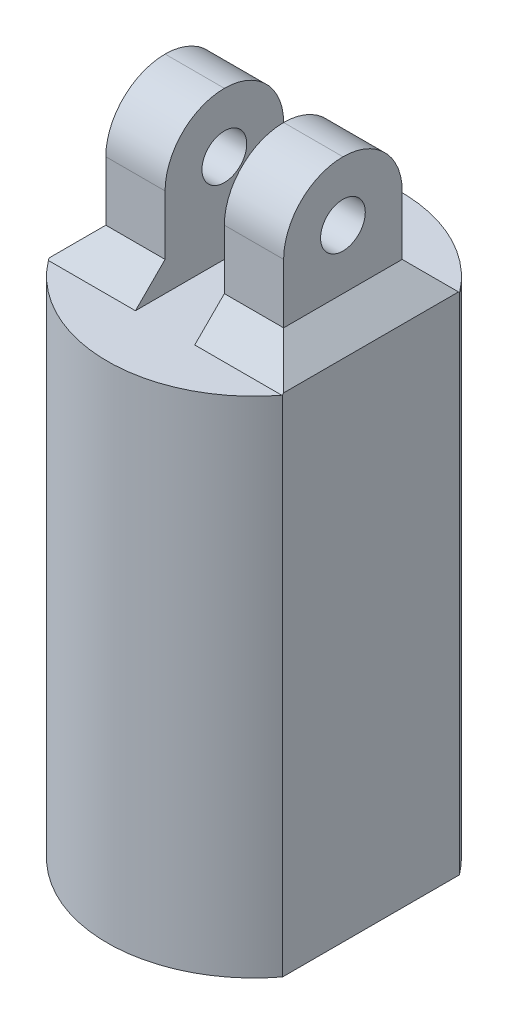
ISO-10303-21;
HEADER;
FILE_DESCRIPTION(('STEP AP214'),'2;1');
FILE_NAME('part.step','',(''),(''),'','','');
FILE_SCHEMA(('AUTOMOTIVE_DESIGN { 1 0 10303 214 1 1 1 1 }'));
ENDSEC;
DATA;
#1=APPLICATION_CONTEXT('core data for automotive mechanical design processes');
#2=APPLICATION_PROTOCOL_DEFINITION('international standard','automotive_design',2000,#1);
#3=PRODUCT_CONTEXT('',#1,'mechanical');
#4=PRODUCT('Part','Part','',(#3));
#5=PRODUCT_RELATED_PRODUCT_CATEGORY('part','',(#4));
#6=PRODUCT_DEFINITION_FORMATION('','',#4);
#7=PRODUCT_DEFINITION_CONTEXT('part definition',#1,'design');
#8=PRODUCT_DEFINITION('design','',#6,#7);
#9=PRODUCT_DEFINITION_SHAPE('','',#8);
#10=(LENGTH_UNIT() NAMED_UNIT(*) SI_UNIT(.MILLI.,.METRE.));
#11=(NAMED_UNIT(*) PLANE_ANGLE_UNIT() SI_UNIT($,.RADIAN.));
#12=(NAMED_UNIT(*) SI_UNIT($,.STERADIAN.) SOLID_ANGLE_UNIT());
#13=UNCERTAINTY_MEASURE_WITH_UNIT(LENGTH_MEASURE(1.E-05),#10,'distance_accuracy_value','');
#14=(GEOMETRIC_REPRESENTATION_CONTEXT(3) GLOBAL_UNCERTAINTY_ASSIGNED_CONTEXT((#13)) GLOBAL_UNIT_ASSIGNED_CONTEXT((#10,
#11,#12)) REPRESENTATION_CONTEXT('',''));
#15=CARTESIAN_POINT('',(0.,0.,0.));
#16=DIRECTION('',(0.,0.,1.));
#17=DIRECTION('',(1.,0.,0.));
#18=AXIS2_PLACEMENT_3D('',#15,#16,#17);
#19=CARTESIAN_POINT('',(0.,34.,0.));
#20=DIRECTION('',(0.,1.,0.));
#21=DIRECTION('',(0.,0.,1.));
#22=AXIS2_PLACEMENT_3D('',#19,#20,#21);
#23=PLANE('',#22);
#24=CARTESIAN_POINT('',(0.,34.,0.));
#25=DIRECTION('',(0.,1.,0.));
#26=DIRECTION('',(0.,0.,1.));
#27=AXIS2_PLACEMENT_3D('',#24,#25,#26);
#28=CIRCLE('',#27,9.9);
#29=CARTESIAN_POINT('',(7.874642849044,34.,-6.00000000000001));
#30=VERTEX_POINT('',#29);
#31=CARTESIAN_POINT('',(-7.87464284904402,34.,-5.99999999999999));
#32=VERTEX_POINT('',#31);
#33=EDGE_CURVE('E270',#30,#32,#28,.T.);
#34=ORIENTED_EDGE('',*,*,#33,.T.);
#35=DIRECTION('',(1.,0.,0.));
#36=VECTOR('',#35,1.);
#37=CARTESIAN_POINT('',(0.,34.,-5.99999999999999));
#38=LINE('',#37,#36);
#39=CARTESIAN_POINT('',(-2.,34.,-5.99999999999999));
#40=VERTEX_POINT('',#39);
#41=EDGE_CURVE('E343',#32,#40,#38,.T.);
#42=ORIENTED_EDGE('',*,*,#41,.T.);
#43=DIRECTION('',(0.,0.,-1.));
#44=VECTOR('',#43,1.);
#45=CARTESIAN_POINT('',(-2.,34.,4.));
#46=LINE('',#45,#44);
#47=CARTESIAN_POINT('',(-2.,34.,5.99999999999999));
#48=VERTEX_POINT('',#47);
#49=EDGE_CURVE('E472',#48,#40,#46,.T.);
#50=ORIENTED_EDGE('',*,*,#49,.F.);
#51=DIRECTION('',(-1.,0.,0.));
#52=VECTOR('',#51,1.);
#53=CARTESIAN_POINT('',(0.,34.,5.99999999999999));
#54=LINE('',#53,#52);
#55=CARTESIAN_POINT('',(-7.87464284904402,34.,5.99999999999999));
#56=VERTEX_POINT('',#55);
#57=EDGE_CURVE('E340',#48,#56,#54,.T.);
#58=ORIENTED_EDGE('',*,*,#57,.T.);
#59=CARTESIAN_POINT('',(0.,34.,0.));
#60=DIRECTION('',(0.,1.,0.));
#61=DIRECTION('',(0.,0.,1.));
#62=AXIS2_PLACEMENT_3D('',#59,#60,#61);
#63=CIRCLE('',#62,9.9);
#64=CARTESIAN_POINT('',(7.874642849044,34.,6.00000000000001));
#65=VERTEX_POINT('',#64);
#66=EDGE_CURVE('E262',#56,#65,#63,.T.);
#67=ORIENTED_EDGE('',*,*,#66,.T.);
#68=DIRECTION('',(-1.,0.,0.));
#69=VECTOR('',#68,1.);
#70=CARTESIAN_POINT('',(0.,34.,6.00000000000001));
#71=LINE('',#70,#69);
#72=CARTESIAN_POINT('',(2.,34.,6.00000000000001));
#73=VERTEX_POINT('',#72);
#74=EDGE_CURVE('E333',#65,#73,#71,.T.);
#75=ORIENTED_EDGE('',*,*,#74,.T.);
#76=DIRECTION('',(0.,0.,1.));
#77=VECTOR('',#76,1.);
#78=CARTESIAN_POINT('',(2.,34.,4.));
#79=LINE('',#78,#77);
#80=CARTESIAN_POINT('',(2.,34.,-6.00000000000001));
#81=VERTEX_POINT('',#80);
#82=EDGE_CURVE('E454',#81,#73,#79,.T.);
#83=ORIENTED_EDGE('',*,*,#82,.F.);
#84=DIRECTION('',(1.,0.,0.));
#85=VECTOR('',#84,1.);
#86=CARTESIAN_POINT('',(0.,34.,-6.00000000000001));
#87=LINE('',#86,#85);
#88=EDGE_CURVE('E337',#81,#30,#87,.T.);
#89=ORIENTED_EDGE('',*,*,#88,.T.);
#90=EDGE_LOOP('',(#34,#42,#50,#58,#67,#75,#83,#89));
#91=FACE_BOUND('',#90,.T.);
#92=ADVANCED_FACE('F49',(#91),#23,.T.);
#93=CARTESIAN_POINT('',(0.,34.,0.));
#94=DIRECTION('',(0.,-1.,0.));
#95=DIRECTION('',(0.,0.,-1.));
#96=AXIS2_PLACEMENT_3D('',#93,#94,#95);
#97=CYLINDRICAL_SURFACE('',#96,9.9);
#98=CARTESIAN_POINT('',(0.,0.,0.));
#99=DIRECTION('',(0.,1.,0.));
#100=DIRECTION('',(0.,0.,1.));
#101=AXIS2_PLACEMENT_3D('',#98,#99,#100);
#102=CIRCLE('',#101,9.9);
#103=CARTESIAN_POINT('',(7.9,0.,-5.96657355607052));
#104=VERTEX_POINT('',#103);
#105=CARTESIAN_POINT('',(-7.9,0.,-5.96657355607052));
#106=VERTEX_POINT('',#105);
#107=EDGE_CURVE('E234',#104,#106,#102,.T.);
#108=ORIENTED_EDGE('',*,*,#107,.T.);
#109=DIRECTION('',(0.,-1.,0.));
#110=VECTOR('',#109,1.);
#111=CARTESIAN_POINT('',(-7.9,34.,-5.96657355607052));
#112=LINE('',#111,#110);
#113=CARTESIAN_POINT('',(-7.9,34.0334264439295,-5.96657355607052));
#114=VERTEX_POINT('',#113);
#115=EDGE_CURVE('E241',#114,#106,#112,.T.);
#116=ORIENTED_EDGE('',*,*,#115,.F.);
#117=CARTESIAN_POINT('',(0.,40.0000000000001,0.));
#118=DIRECTION('',(0.,-0.707106781186544,0.707106781186551));
#119=DIRECTION('',(0.,-0.707106781186551,-0.707106781186544));
#120=AXIS2_PLACEMENT_3D('',#117,#118,#119);
#121=ELLIPSE('',#120,14.0007142674937,9.9);
#122=EDGE_CURVE('E365',#114,#32,#121,.T.);
#123=ORIENTED_EDGE('',*,*,#122,.T.);
#124=ORIENTED_EDGE('',*,*,#33,.F.);
#125=CARTESIAN_POINT('',(0.,40.0000000000001,0.));
#126=DIRECTION('',(0.,-0.707106781186544,0.707106781186552));
#127=DIRECTION('',(0.,-0.707106781186552,-0.707106781186544));
#128=AXIS2_PLACEMENT_3D('',#125,#126,#127);
#129=ELLIPSE('',#128,14.0007142674937,9.9);
#130=CARTESIAN_POINT('',(7.9,34.0334264439295,-5.96657355607052));
#131=VERTEX_POINT('',#130);
#132=EDGE_CURVE('E389',#30,#131,#129,.T.);
#133=ORIENTED_EDGE('',*,*,#132,.T.);
#134=DIRECTION('',(0.,-1.,0.));
#135=VECTOR('',#134,1.);
#136=CARTESIAN_POINT('',(7.9,34.,-5.96657355607052));
#137=LINE('',#136,#135);
#138=EDGE_CURVE('E82',#131,#104,#137,.T.);
#139=ORIENTED_EDGE('',*,*,#138,.T.);
#140=EDGE_LOOP('',(#108,#116,#123,#124,#133,#139));
#141=FACE_BOUND('',#140,.T.);
#142=ADVANCED_FACE('F251',(#141),#97,.T.);
#143=CARTESIAN_POINT('',(-7.9,34.,-5.96657355607052));
#144=DIRECTION('',(1.,0.,0.));
#145=DIRECTION('',(0.,0.,-1.));
#146=AXIS2_PLACEMENT_3D('',#143,#144,#145);
#147=PLANE('',#146);
#148=DIRECTION('',(0.,-1.,0.));
#149=VECTOR('',#148,1.);
#150=CARTESIAN_POINT('',(-7.9,34.,5.96657355607052));
#151=LINE('',#150,#149);
#152=CARTESIAN_POINT('',(-7.9,34.0334264439295,5.96657355607052));
#153=VERTEX_POINT('',#152);
#154=CARTESIAN_POINT('',(-7.9,0.,5.96657355607052));
#155=VERTEX_POINT('',#154);
#156=EDGE_CURVE('E249',#153,#155,#151,.T.);
#157=ORIENTED_EDGE('',*,*,#156,.F.);
#158=DIRECTION('',(0.,0.707106781186551,-0.707106781186544));
#159=VECTOR('',#158,1.);
#160=CARTESIAN_POINT('',(-7.9,39.9832867780353,0.0167132219648022));
#161=LINE('',#160,#159);
#162=CARTESIAN_POINT('',(-7.9,34.1,5.9));
#163=VERTEX_POINT('',#162);
#164=EDGE_CURVE('E382',#153,#163,#161,.T.);
#165=ORIENTED_EDGE('',*,*,#164,.T.);
#166=DIRECTION('',(0.,0.,-1.));
#167=VECTOR('',#166,1.);
#168=CARTESIAN_POINT('',(-7.9,34.1,-5.96657355607052));
#169=LINE('',#168,#167);
#170=CARTESIAN_POINT('',(-7.9,34.1,-5.9));
#171=VERTEX_POINT('',#170);
#172=EDGE_CURVE('E371',#163,#171,#169,.T.);
#173=ORIENTED_EDGE('',*,*,#172,.T.);
#174=DIRECTION('',(0.,-0.707106781186551,-0.707106781186544));
#175=VECTOR('',#174,1.);
#176=CARTESIAN_POINT('',(-7.9,34.0167132219647,-5.98328677803526));
#177=LINE('',#176,#175);
#178=EDGE_CURVE('E244',#171,#114,#177,.T.);
#179=ORIENTED_EDGE('',*,*,#178,.T.);
#180=ORIENTED_EDGE('',*,*,#115,.T.);
#181=DIRECTION('',(0.,0.,1.));
#182=VECTOR('',#181,1.);
#183=CARTESIAN_POINT('',(-7.9,0.,-5.96657355607052));
#184=LINE('',#183,#182);
#185=EDGE_CURVE('E229',#106,#155,#184,.T.);
#186=ORIENTED_EDGE('',*,*,#185,.T.);
#187=EDGE_LOOP('',(#157,#165,#173,#179,#180,#186));
#188=FACE_BOUND('',#187,.T.);
#189=ADVANCED_FACE('F242',(#188),#147,.F.);
#190=CARTESIAN_POINT('',(0.,34.,0.));
#191=DIRECTION('',(0.,-1.,0.));
#192=DIRECTION('',(0.,0.,-1.));
#193=AXIS2_PLACEMENT_3D('',#190,#191,#192);
#194=CYLINDRICAL_SURFACE('',#193,9.9);
#195=CARTESIAN_POINT('',(0.,0.,0.));
#196=DIRECTION('',(0.,1.,0.));
#197=DIRECTION('',(0.,0.,1.));
#198=AXIS2_PLACEMENT_3D('',#195,#196,#197);
#199=CIRCLE('',#198,9.9);
#200=CARTESIAN_POINT('',(7.9,0.,5.96657355607052));
#201=VERTEX_POINT('',#200);
#202=EDGE_CURVE('E235',#155,#201,#199,.T.);
#203=ORIENTED_EDGE('',*,*,#202,.T.);
#204=DIRECTION('',(0.,-1.,0.));
#205=VECTOR('',#204,1.);
#206=CARTESIAN_POINT('',(7.9,34.,5.96657355607052));
#207=LINE('',#206,#205);
#208=CARTESIAN_POINT('',(7.9,34.0334264439295,5.96657355607052));
#209=VERTEX_POINT('',#208);
#210=EDGE_CURVE('E71',#209,#201,#207,.T.);
#211=ORIENTED_EDGE('',*,*,#210,.F.);
#212=CARTESIAN_POINT('',(0.,40.0000000000001,0.));
#213=DIRECTION('',(0.,-0.707106781186544,-0.707106781186552));
#214=DIRECTION('',(0.,-0.707106781186552,0.707106781186544));
#215=AXIS2_PLACEMENT_3D('',#212,#213,#214);
#216=ELLIPSE('',#215,14.0007142674937,9.9);
#217=EDGE_CURVE('E398',#209,#65,#216,.T.);
#218=ORIENTED_EDGE('',*,*,#217,.T.);
#219=ORIENTED_EDGE('',*,*,#66,.F.);
#220=CARTESIAN_POINT('',(0.,40.0000000000001,0.));
#221=DIRECTION('',(0.,-0.707106781186544,-0.707106781186551));
#222=DIRECTION('',(0.,-0.707106781186551,0.707106781186544));
#223=AXIS2_PLACEMENT_3D('',#220,#221,#222);
#224=ELLIPSE('',#223,14.0007142674937,9.9);
#225=EDGE_CURVE('E378',#56,#153,#224,.T.);
#226=ORIENTED_EDGE('',*,*,#225,.T.);
#227=ORIENTED_EDGE('',*,*,#156,.T.);
#228=EDGE_LOOP('',(#203,#211,#218,#219,#226,#227));
#229=FACE_BOUND('',#228,.T.);
#230=ADVANCED_FACE('F510',(#229),#194,.T.);
#231=CARTESIAN_POINT('',(7.9,34.,-5.96657355607052));
#232=DIRECTION('',(-1.,0.,0.));
#233=DIRECTION('',(0.,0.,1.));
#234=AXIS2_PLACEMENT_3D('',#231,#232,#233);
#235=PLANE('',#234);
#236=DIRECTION('',(0.,0.,-1.));
#237=VECTOR('',#236,1.);
#238=CARTESIAN_POINT('',(7.9,0.,-5.96657355607052));
#239=LINE('',#238,#237);
#240=EDGE_CURVE('E267',#201,#104,#239,.T.);
#241=ORIENTED_EDGE('',*,*,#240,.T.);
#242=ORIENTED_EDGE('',*,*,#138,.F.);
#243=DIRECTION('',(0.,0.707106781186552,0.707106781186544));
#244=VECTOR('',#243,1.);
#245=CARTESIAN_POINT('',(7.9,34.0167132219647,-5.98328677803527));
#246=LINE('',#245,#244);
#247=CARTESIAN_POINT('',(7.9,34.1,-5.9));
#248=VERTEX_POINT('',#247);
#249=EDGE_CURVE('E392',#131,#248,#246,.T.);
#250=ORIENTED_EDGE('',*,*,#249,.T.);
#251=DIRECTION('',(0.,0.,1.));
#252=VECTOR('',#251,1.);
#253=CARTESIAN_POINT('',(7.9,34.1,-5.96657355607052));
#254=LINE('',#253,#252);
#255=CARTESIAN_POINT('',(7.9,34.1,5.9));
#256=VERTEX_POINT('',#255);
#257=EDGE_CURVE('E11',#248,#256,#254,.T.);
#258=ORIENTED_EDGE('',*,*,#257,.T.);
#259=DIRECTION('',(0.,-0.707106781186552,0.707106781186544));
#260=VECTOR('',#259,1.);
#261=CARTESIAN_POINT('',(7.9,39.9832867780353,0.0167132219648161));
#262=LINE('',#261,#260);
#263=EDGE_CURVE('E395',#256,#209,#262,.T.);
#264=ORIENTED_EDGE('',*,*,#263,.T.);
#265=ORIENTED_EDGE('',*,*,#210,.T.);
#266=EDGE_LOOP('',(#241,#242,#250,#258,#264,#265));
#267=FACE_BOUND('',#266,.T.);
#268=ADVANCED_FACE('F431',(#267),#235,.F.);
#269=CARTESIAN_POINT('',(0.,0.,0.));
#270=DIRECTION('',(0.,1.,0.));
#271=DIRECTION('',(0.,0.,1.));
#272=AXIS2_PLACEMENT_3D('',#269,#270,#271);
#273=PLANE('',#272);
#274=CARTESIAN_POINT('',(0.,0.,0.));
#275=DIRECTION('',(0.,-1.,0.));
#276=DIRECTION('',(0.,0.,-1.));
#277=AXIS2_PLACEMENT_3D('',#274,#275,#276);
#278=CIRCLE('',#277,1.5);
#279=CARTESIAN_POINT('',(0.,0.,-1.5));
#280=VERTEX_POINT('',#279);
#281=EDGE_CURVE('E409',#280,#280,#278,.T.);
#282=ORIENTED_EDGE('',*,*,#281,.F.);
#283=EDGE_LOOP('',(#282));
#284=FACE_BOUND('',#283,.T.);
#285=ORIENTED_EDGE('',*,*,#107,.F.);
#286=ORIENTED_EDGE('',*,*,#240,.F.);
#287=ORIENTED_EDGE('',*,*,#202,.F.);
#288=ORIENTED_EDGE('',*,*,#185,.F.);
#289=EDGE_LOOP('',(#285,#286,#287,#288));
#290=FACE_BOUND('',#289,.T.);
#291=ADVANCED_FACE('F231',(#284,#290),#273,.F.);
#292=CARTESIAN_POINT('',(2.,44.,4.));
#293=DIRECTION('',(0.,0.,-1.));
#294=DIRECTION('',(-1.,0.,0.));
#295=AXIS2_PLACEMENT_3D('',#292,#293,#294);
#296=PLANE('',#295);
#297=DIRECTION('',(0.,-1.,0.));
#298=VECTOR('',#297,1.);
#299=CARTESIAN_POINT('',(2.,44.,4.));
#300=LINE('',#299,#298);
#301=CARTESIAN_POINT('',(2.,40.,4.));
#302=VERTEX_POINT('',#301);
#303=CARTESIAN_POINT('',(2.,36.,4.));
#304=VERTEX_POINT('',#303);
#305=EDGE_CURVE('E450',#302,#304,#300,.T.);
#306=ORIENTED_EDGE('',*,*,#305,.T.);
#307=DIRECTION('',(1.,0.,0.));
#308=VECTOR('',#307,1.);
#309=CARTESIAN_POINT('',(2.,36.,4.));
#310=LINE('',#309,#308);
#311=CARTESIAN_POINT('',(6.,36.,4.));
#312=VERTEX_POINT('',#311);
#313=EDGE_CURVE('E357',#304,#312,#310,.T.);
#314=ORIENTED_EDGE('',*,*,#313,.T.);
#315=DIRECTION('',(0.,-1.,0.));
#316=VECTOR('',#315,1.);
#317=CARTESIAN_POINT('',(6.,44.,4.));
#318=LINE('',#317,#316);
#319=CARTESIAN_POINT('',(6.,40.,4.));
#320=VERTEX_POINT('',#319);
#321=EDGE_CURVE('E253',#320,#312,#318,.T.);
#322=ORIENTED_EDGE('',*,*,#321,.F.);
#323=DIRECTION('',(1.,0.,0.));
#324=VECTOR('',#323,1.);
#325=CARTESIAN_POINT('',(2.,40.,4.));
#326=LINE('',#325,#324);
#327=EDGE_CURVE('E288',#320,#302,#326,.F.);
#328=ORIENTED_EDGE('',*,*,#327,.T.);
#329=EDGE_LOOP('',(#306,#314,#322,#328));
#330=FACE_BOUND('',#329,.T.);
#331=ADVANCED_FACE('F500',(#330),#296,.F.);
#332=CARTESIAN_POINT('',(6.,44.,4.));
#333=DIRECTION('',(-1.,0.,0.));
#334=DIRECTION('',(0.,0.,1.));
#335=AXIS2_PLACEMENT_3D('',#332,#333,#334);
#336=PLANE('',#335);
#337=CARTESIAN_POINT('',(6.,40.,0.));
#338=DIRECTION('',(1.,0.,0.));
#339=DIRECTION('',(0.,0.,-1.));
#340=AXIS2_PLACEMENT_3D('',#337,#338,#339);
#341=CIRCLE('',#340,1.51);
#342=CARTESIAN_POINT('',(6.,40.,-1.51));
#343=VERTEX_POINT('',#342);
#344=EDGE_CURVE('E282',#343,#343,#341,.T.);
#345=ORIENTED_EDGE('',*,*,#344,.F.);
#346=EDGE_LOOP('',(#345));
#347=FACE_BOUND('',#346,.T.);
#348=ORIENTED_EDGE('',*,*,#321,.T.);
#349=DIRECTION('',(0.,0.,-1.));
#350=VECTOR('',#349,1.);
#351=CARTESIAN_POINT('',(6.,36.,4.));
#352=LINE('',#351,#350);
#353=CARTESIAN_POINT('',(6.,36.,-4.));
#354=VERTEX_POINT('',#353);
#355=EDGE_CURVE('E360',#312,#354,#352,.T.);
#356=ORIENTED_EDGE('',*,*,#355,.T.);
#357=DIRECTION('',(0.,-1.,0.));
#358=VECTOR('',#357,1.);
#359=CARTESIAN_POINT('',(6.,44.,-4.));
#360=LINE('',#359,#358);
#361=CARTESIAN_POINT('',(6.,40.,-4.));
#362=VERTEX_POINT('',#361);
#363=EDGE_CURVE('E259',#362,#354,#360,.T.);
#364=ORIENTED_EDGE('',*,*,#363,.F.);
#365=CARTESIAN_POINT('',(6.,40.,0.));
#366=DIRECTION('',(-1.,0.,0.));
#367=DIRECTION('',(0.,0.,1.));
#368=AXIS2_PLACEMENT_3D('',#365,#366,#367);
#369=CIRCLE('',#368,4.);
#370=CARTESIAN_POINT('',(6.,44.,0.));
#371=VERTEX_POINT('',#370);
#372=EDGE_CURVE('E248',#362,#371,#369,.F.);
#373=ORIENTED_EDGE('',*,*,#372,.T.);
#374=CARTESIAN_POINT('',(6.,40.,0.));
#375=DIRECTION('',(-1.,0.,0.));
#376=DIRECTION('',(0.,0.,1.));
#377=AXIS2_PLACEMENT_3D('',#374,#375,#376);
#378=CIRCLE('',#377,4.);
#379=EDGE_CURVE('E285',#371,#320,#378,.F.);
#380=ORIENTED_EDGE('',*,*,#379,.T.);
#381=EDGE_LOOP('',(#348,#356,#364,#373,#380));
#382=FACE_BOUND('',#381,.T.);
#383=ADVANCED_FACE('F506',(#347,#382),#336,.F.);
#384=CARTESIAN_POINT('',(2.,44.,-4.));
#385=DIRECTION('',(0.,0.,1.));
#386=DIRECTION('',(1.,0.,0.));
#387=AXIS2_PLACEMENT_3D('',#384,#385,#386);
#388=PLANE('',#387);
#389=ORIENTED_EDGE('',*,*,#363,.T.);
#390=DIRECTION('',(-1.,0.,0.));
#391=VECTOR('',#390,1.);
#392=CARTESIAN_POINT('',(2.,36.,-4.));
#393=LINE('',#392,#391);
#394=CARTESIAN_POINT('',(2.,36.,-4.));
#395=VERTEX_POINT('',#394);
#396=EDGE_CURVE('E353',#354,#395,#393,.T.);
#397=ORIENTED_EDGE('',*,*,#396,.T.);
#398=DIRECTION('',(0.,-1.,0.));
#399=VECTOR('',#398,1.);
#400=CARTESIAN_POINT('',(2.,44.,-4.));
#401=LINE('',#400,#399);
#402=CARTESIAN_POINT('',(2.,40.,-4.));
#403=VERTEX_POINT('',#402);
#404=EDGE_CURVE('E446',#403,#395,#401,.T.);
#405=ORIENTED_EDGE('',*,*,#404,.F.);
#406=DIRECTION('',(-1.,0.,0.));
#407=VECTOR('',#406,1.);
#408=CARTESIAN_POINT('',(6.,40.,-4.));
#409=LINE('',#408,#407);
#410=EDGE_CURVE('E298',#403,#362,#409,.F.);
#411=ORIENTED_EDGE('',*,*,#410,.T.);
#412=EDGE_LOOP('',(#389,#397,#405,#411));
#413=FACE_BOUND('',#412,.T.);
#414=ADVANCED_FACE('F522',(#413),#388,.F.);
#415=CARTESIAN_POINT('',(2.,44.,4.));
#416=DIRECTION('',(1.,0.,0.));
#417=DIRECTION('',(0.,0.,-1.));
#418=AXIS2_PLACEMENT_3D('',#415,#416,#417);
#419=PLANE('',#418);
#420=CARTESIAN_POINT('',(2.,40.,0.));
#421=DIRECTION('',(1.,0.,0.));
#422=DIRECTION('',(0.,0.,-1.));
#423=AXIS2_PLACEMENT_3D('',#420,#421,#422);
#424=CIRCLE('',#423,1.51);
#425=CARTESIAN_POINT('',(2.,40.,-1.51));
#426=VERTEX_POINT('',#425);
#427=EDGE_CURVE('E475',#426,#426,#424,.T.);
#428=ORIENTED_EDGE('',*,*,#427,.T.);
#429=EDGE_LOOP('',(#428));
#430=FACE_BOUND('',#429,.T.);
#431=ORIENTED_EDGE('',*,*,#305,.F.);
#432=CARTESIAN_POINT('',(2.,40.,0.));
#433=DIRECTION('',(1.,0.,0.));
#434=DIRECTION('',(0.,0.,-1.));
#435=AXIS2_PLACEMENT_3D('',#432,#433,#434);
#436=CIRCLE('',#435,4.);
#437=CARTESIAN_POINT('',(2.,44.,0.));
#438=VERTEX_POINT('',#437);
#439=EDGE_CURVE('E295',#302,#438,#436,.F.);
#440=ORIENTED_EDGE('',*,*,#439,.T.);
#441=CARTESIAN_POINT('',(2.,40.,0.));
#442=DIRECTION('',(1.,0.,0.));
#443=DIRECTION('',(0.,0.,-1.));
#444=AXIS2_PLACEMENT_3D('',#441,#442,#443);
#445=CIRCLE('',#444,4.);
#446=EDGE_CURVE('E292',#438,#403,#445,.F.);
#447=ORIENTED_EDGE('',*,*,#446,.T.);
#448=ORIENTED_EDGE('',*,*,#404,.T.);
#449=DIRECTION('',(0.,-0.707106781186552,-0.707106781186544));
#450=VECTOR('',#449,1.);
#451=CARTESIAN_POINT('',(2.,44.0000000000001,3.99999999999994));
#452=LINE('',#451,#450);
#453=EDGE_CURVE('E385',#395,#81,#452,.T.);
#454=ORIENTED_EDGE('',*,*,#453,.T.);
#455=ORIENTED_EDGE('',*,*,#82,.T.);
#456=DIRECTION('',(0.,0.707106781186552,-0.707106781186544));
#457=VECTOR('',#456,1.);
#458=CARTESIAN_POINT('',(2.,40.0000000000001,0.));
#459=LINE('',#458,#457);
#460=EDGE_CURVE('E60',#73,#304,#459,.T.);
#461=ORIENTED_EDGE('',*,*,#460,.T.);
#462=EDGE_LOOP('',(#431,#440,#447,#448,#454,#455,#461));
#463=FACE_BOUND('',#462,.T.);
#464=ADVANCED_FACE('F526',(#430,#463),#419,.F.);
#465=CARTESIAN_POINT('',(-6.,44.,4.));
#466=DIRECTION('',(0.,0.,-1.));
#467=DIRECTION('',(-1.,0.,0.));
#468=AXIS2_PLACEMENT_3D('',#465,#466,#467);
#469=PLANE('',#468);
#470=DIRECTION('',(0.,-1.,0.));
#471=VECTOR('',#470,1.);
#472=CARTESIAN_POINT('',(-6.,44.,4.));
#473=LINE('',#472,#471);
#474=CARTESIAN_POINT('',(-6.,40.,4.));
#475=VERTEX_POINT('',#474);
#476=CARTESIAN_POINT('',(-6.,36.,4.));
#477=VERTEX_POINT('',#476);
#478=EDGE_CURVE('E468',#475,#477,#473,.T.);
#479=ORIENTED_EDGE('',*,*,#478,.T.);
#480=DIRECTION('',(1.,0.,0.));
#481=VECTOR('',#480,1.);
#482=CARTESIAN_POINT('',(-6.,36.,4.));
#483=LINE('',#482,#481);
#484=CARTESIAN_POINT('',(-2.,36.,4.));
#485=VERTEX_POINT('',#484);
#486=EDGE_CURVE('E350',#477,#485,#483,.T.);
#487=ORIENTED_EDGE('',*,*,#486,.T.);
#488=DIRECTION('',(0.,-1.,0.));
#489=VECTOR('',#488,1.);
#490=CARTESIAN_POINT('',(-2.,44.,4.));
#491=LINE('',#490,#489);
#492=CARTESIAN_POINT('',(-2.,40.,4.));
#493=VERTEX_POINT('',#492);
#494=EDGE_CURVE('E456',#493,#485,#491,.T.);
#495=ORIENTED_EDGE('',*,*,#494,.F.);
#496=DIRECTION('',(1.,0.,0.));
#497=VECTOR('',#496,1.);
#498=CARTESIAN_POINT('',(-6.,40.,4.));
#499=LINE('',#498,#497);
#500=EDGE_CURVE('E317',#493,#475,#499,.F.);
#501=ORIENTED_EDGE('',*,*,#500,.T.);
#502=EDGE_LOOP('',(#479,#487,#495,#501));
#503=FACE_BOUND('',#502,.T.);
#504=ADVANCED_FACE('F530',(#503),#469,.F.);
#505=CARTESIAN_POINT('',(-2.,44.,4.));
#506=DIRECTION('',(-1.,0.,0.));
#507=DIRECTION('',(0.,0.,1.));
#508=AXIS2_PLACEMENT_3D('',#505,#506,#507);
#509=PLANE('',#508);
#510=CARTESIAN_POINT('',(-2.,40.,0.));
#511=DIRECTION('',(-1.,0.,0.));
#512=DIRECTION('',(0.,0.,1.));
#513=AXIS2_PLACEMENT_3D('',#510,#511,#512);
#514=CIRCLE('',#513,1.51);
#515=CARTESIAN_POINT('',(-2.,40.,1.51));
#516=VERTEX_POINT('',#515);
#517=EDGE_CURVE('E281',#516,#516,#514,.T.);
#518=ORIENTED_EDGE('',*,*,#517,.T.);
#519=EDGE_LOOP('',(#518));
#520=FACE_BOUND('',#519,.T.);
#521=DIRECTION('',(0.,-1.,0.));
#522=VECTOR('',#521,1.);
#523=CARTESIAN_POINT('',(-2.,44.,-4.));
#524=LINE('',#523,#522);
#525=CARTESIAN_POINT('',(-2.,40.,-4.));
#526=VERTEX_POINT('',#525);
#527=CARTESIAN_POINT('',(-2.,36.,-4.));
#528=VERTEX_POINT('',#527);
#529=EDGE_CURVE('E460',#526,#528,#524,.T.);
#530=ORIENTED_EDGE('',*,*,#529,.F.);
#531=CARTESIAN_POINT('',(-2.,40.,0.));
#532=DIRECTION('',(-1.,0.,0.));
#533=DIRECTION('',(0.,0.,1.));
#534=AXIS2_PLACEMENT_3D('',#531,#532,#533);
#535=CIRCLE('',#534,4.);
#536=CARTESIAN_POINT('',(-2.,44.,0.));
#537=VERTEX_POINT('',#536);
#538=EDGE_CURVE('E314',#526,#537,#535,.F.);
#539=ORIENTED_EDGE('',*,*,#538,.T.);
#540=CARTESIAN_POINT('',(-2.,40.,0.));
#541=DIRECTION('',(-1.,0.,0.));
#542=DIRECTION('',(0.,0.,1.));
#543=AXIS2_PLACEMENT_3D('',#540,#541,#542);
#544=CIRCLE('',#543,4.);
#545=EDGE_CURVE('E311',#537,#493,#544,.F.);
#546=ORIENTED_EDGE('',*,*,#545,.T.);
#547=ORIENTED_EDGE('',*,*,#494,.T.);
#548=DIRECTION('',(0.,-0.707106781186551,0.707106781186544));
#549=VECTOR('',#548,1.);
#550=CARTESIAN_POINT('',(-2.,40.,0.));
#551=LINE('',#550,#549);
#552=EDGE_CURVE('E374',#485,#48,#551,.T.);
#553=ORIENTED_EDGE('',*,*,#552,.T.);
#554=ORIENTED_EDGE('',*,*,#49,.T.);
#555=DIRECTION('',(0.,0.707106781186551,0.707106781186544));
#556=VECTOR('',#555,1.);
#557=CARTESIAN_POINT('',(-2.,44.,3.99999999999995));
#558=LINE('',#557,#556);
#559=EDGE_CURVE('E368',#40,#528,#558,.T.);
#560=ORIENTED_EDGE('',*,*,#559,.T.);
#561=EDGE_LOOP('',(#530,#539,#546,#547,#553,#554,#560));
#562=FACE_BOUND('',#561,.T.);
#563=ADVANCED_FACE('F534',(#520,#562),#509,.F.);
#564=CARTESIAN_POINT('',(-6.,44.,-4.));
#565=DIRECTION('',(0.,0.,1.));
#566=DIRECTION('',(1.,0.,0.));
#567=AXIS2_PLACEMENT_3D('',#564,#565,#566);
#568=PLANE('',#567);
#569=ORIENTED_EDGE('',*,*,#529,.T.);
#570=DIRECTION('',(-1.,0.,0.));
#571=VECTOR('',#570,1.);
#572=CARTESIAN_POINT('',(-6.,36.,-4.));
#573=LINE('',#572,#571);
#574=CARTESIAN_POINT('',(-6.,36.,-4.));
#575=VERTEX_POINT('',#574);
#576=EDGE_CURVE('E320',#528,#575,#573,.T.);
#577=ORIENTED_EDGE('',*,*,#576,.T.);
#578=DIRECTION('',(0.,-1.,0.));
#579=VECTOR('',#578,1.);
#580=CARTESIAN_POINT('',(-6.,44.,-4.));
#581=LINE('',#580,#579);
#582=CARTESIAN_POINT('',(-6.,40.,-4.));
#583=VERTEX_POINT('',#582);
#584=EDGE_CURVE('E464',#583,#575,#581,.T.);
#585=ORIENTED_EDGE('',*,*,#584,.F.);
#586=DIRECTION('',(-1.,0.,0.));
#587=VECTOR('',#586,1.);
#588=CARTESIAN_POINT('',(-2.,40.,-4.));
#589=LINE('',#588,#587);
#590=EDGE_CURVE('E307',#583,#526,#589,.F.);
#591=ORIENTED_EDGE('',*,*,#590,.T.);
#592=EDGE_LOOP('',(#569,#577,#585,#591));
#593=FACE_BOUND('',#592,.T.);
#594=ADVANCED_FACE('F538',(#593),#568,.F.);
#595=CARTESIAN_POINT('',(-6.,44.,4.));
#596=DIRECTION('',(1.,0.,0.));
#597=DIRECTION('',(0.,0.,-1.));
#598=AXIS2_PLACEMENT_3D('',#595,#596,#597);
#599=PLANE('',#598);
#600=CARTESIAN_POINT('',(-6.,40.,0.));
#601=DIRECTION('',(1.,0.,0.));
#602=DIRECTION('',(0.,0.,-1.));
#603=AXIS2_PLACEMENT_3D('',#600,#601,#602);
#604=CIRCLE('',#603,1.51);
#605=CARTESIAN_POINT('',(-6.,40.,-1.51));
#606=VERTEX_POINT('',#605);
#607=EDGE_CURVE('E277',#606,#606,#604,.T.);
#608=ORIENTED_EDGE('',*,*,#607,.T.);
#609=EDGE_LOOP('',(#608));
#610=FACE_BOUND('',#609,.T.);
#611=ORIENTED_EDGE('',*,*,#584,.T.);
#612=DIRECTION('',(0.,0.,1.));
#613=VECTOR('',#612,1.);
#614=CARTESIAN_POINT('',(-6.,36.,4.));
#615=LINE('',#614,#613);
#616=EDGE_CURVE('E347',#575,#477,#615,.T.);
#617=ORIENTED_EDGE('',*,*,#616,.T.);
#618=ORIENTED_EDGE('',*,*,#478,.F.);
#619=CARTESIAN_POINT('',(-6.,40.,0.));
#620=DIRECTION('',(1.,0.,0.));
#621=DIRECTION('',(0.,0.,-1.));
#622=AXIS2_PLACEMENT_3D('',#619,#620,#621);
#623=CIRCLE('',#622,4.);
#624=CARTESIAN_POINT('',(-6.,44.,0.));
#625=VERTEX_POINT('',#624);
#626=EDGE_CURVE('E301',#475,#625,#623,.F.);
#627=ORIENTED_EDGE('',*,*,#626,.T.);
#628=CARTESIAN_POINT('',(-6.,40.,0.));
#629=DIRECTION('',(1.,0.,0.));
#630=DIRECTION('',(0.,0.,-1.));
#631=AXIS2_PLACEMENT_3D('',#628,#629,#630);
#632=CIRCLE('',#631,4.);
#633=EDGE_CURVE('E304',#625,#583,#632,.F.);
#634=ORIENTED_EDGE('',*,*,#633,.T.);
#635=EDGE_LOOP('',(#611,#617,#618,#627,#634));
#636=FACE_BOUND('',#635,.T.);
#637=ADVANCED_FACE('F542',(#610,#636),#599,.F.);
#638=CARTESIAN_POINT('',(-7.9,40.,0.));
#639=DIRECTION('',(1.,0.,0.));
#640=DIRECTION('',(0.,0.,-1.));
#641=AXIS2_PLACEMENT_3D('',#638,#639,#640);
#642=CYLINDRICAL_SURFACE('',#641,1.51);
#643=ORIENTED_EDGE('',*,*,#607,.F.);
#644=EDGE_LOOP('',(#643));
#645=FACE_BOUND('',#644,.T.);
#646=ORIENTED_EDGE('',*,*,#517,.F.);
#647=EDGE_LOOP('',(#646));
#648=FACE_BOUND('',#647,.T.);
#649=ADVANCED_FACE('F546',(#645,#648),#642,.F.);
#650=ORIENTED_EDGE('',*,*,#344,.T.);
#651=EDGE_LOOP('',(#650));
#652=FACE_BOUND('',#651,.T.);
#653=ORIENTED_EDGE('',*,*,#427,.F.);
#654=EDGE_LOOP('',(#653));
#655=FACE_BOUND('',#654,.T.);
#656=ADVANCED_FACE('F548',(#652,#655),#642,.F.);
#657=CARTESIAN_POINT('',(0.,40.,0.));
#658=DIRECTION('',(1.,0.,0.));
#659=DIRECTION('',(0.,0.,-1.));
#660=AXIS2_PLACEMENT_3D('',#657,#658,#659);
#661=CYLINDRICAL_SURFACE('',#660,4.);
#662=ORIENTED_EDGE('',*,*,#410,.F.);
#663=ORIENTED_EDGE('',*,*,#446,.F.);
#664=DIRECTION('',(-1.,0.,0.));
#665=VECTOR('',#664,1.);
#666=CARTESIAN_POINT('',(2.,44.,0.));
#667=LINE('',#666,#665);
#668=EDGE_CURVE('E321',#371,#438,#667,.T.);
#669=ORIENTED_EDGE('',*,*,#668,.F.);
#670=ORIENTED_EDGE('',*,*,#372,.F.);
#671=EDGE_LOOP('',(#662,#663,#669,#670));
#672=FACE_BOUND('',#671,.T.);
#673=ADVANCED_FACE('F550',(#672),#661,.T.);
#674=CARTESIAN_POINT('',(0.,40.,0.));
#675=DIRECTION('',(-1.,0.,0.));
#676=DIRECTION('',(0.,0.,1.));
#677=AXIS2_PLACEMENT_3D('',#674,#675,#676);
#678=CYLINDRICAL_SURFACE('',#677,4.);
#679=ORIENTED_EDGE('',*,*,#439,.F.);
#680=ORIENTED_EDGE('',*,*,#327,.F.);
#681=ORIENTED_EDGE('',*,*,#379,.F.);
#682=ORIENTED_EDGE('',*,*,#668,.T.);
#683=EDGE_LOOP('',(#679,#680,#681,#682));
#684=FACE_BOUND('',#683,.T.);
#685=ADVANCED_FACE('F598',(#684),#678,.T.);
#686=CARTESIAN_POINT('',(0.,40.,0.));
#687=DIRECTION('',(-1.,0.,0.));
#688=DIRECTION('',(0.,0.,1.));
#689=AXIS2_PLACEMENT_3D('',#686,#687,#688);
#690=CYLINDRICAL_SURFACE('',#689,4.);
#691=ORIENTED_EDGE('',*,*,#500,.F.);
#692=ORIENTED_EDGE('',*,*,#545,.F.);
#693=DIRECTION('',(1.,0.,0.));
#694=VECTOR('',#693,1.);
#695=CARTESIAN_POINT('',(-2.,44.,0.));
#696=LINE('',#695,#694);
#697=EDGE_CURVE('E325',#625,#537,#696,.T.);
#698=ORIENTED_EDGE('',*,*,#697,.F.);
#699=ORIENTED_EDGE('',*,*,#626,.F.);
#700=EDGE_LOOP('',(#691,#692,#698,#699));
#701=FACE_BOUND('',#700,.T.);
#702=ADVANCED_FACE('F595',(#701),#690,.T.);
#703=CARTESIAN_POINT('',(0.,40.,0.));
#704=DIRECTION('',(1.,0.,0.));
#705=DIRECTION('',(0.,0.,-1.));
#706=AXIS2_PLACEMENT_3D('',#703,#704,#705);
#707=CYLINDRICAL_SURFACE('',#706,4.);
#708=ORIENTED_EDGE('',*,*,#538,.F.);
#709=ORIENTED_EDGE('',*,*,#590,.F.);
#710=ORIENTED_EDGE('',*,*,#633,.F.);
#711=ORIENTED_EDGE('',*,*,#697,.T.);
#712=EDGE_LOOP('',(#708,#709,#710,#711));
#713=FACE_BOUND('',#712,.T.);
#714=ADVANCED_FACE('F495',(#713),#707,.T.);
#715=CARTESIAN_POINT('',(0.,30.,0.));
#716=DIRECTION('',(0.,-1.,0.));
#717=DIRECTION('',(0.,0.,-1.));
#718=AXIS2_PLACEMENT_3D('',#715,#716,#717);
#719=CYLINDRICAL_SURFACE('',#718,1.5);
#720=CARTESIAN_POINT('',(0.,30.,0.));
#721=DIRECTION('',(0.,-1.,0.));
#722=DIRECTION('',(0.,0.,-1.));
#723=AXIS2_PLACEMENT_3D('',#720,#721,#722);
#724=CIRCLE('',#723,1.5);
#725=CARTESIAN_POINT('',(0.,30.,-1.5));
#726=VERTEX_POINT('',#725);
#727=EDGE_CURVE('E329',#726,#726,#724,.T.);
#728=ORIENTED_EDGE('',*,*,#727,.F.);
#729=EDGE_LOOP('',(#728));
#730=FACE_BOUND('',#729,.T.);
#731=ORIENTED_EDGE('',*,*,#281,.T.);
#732=EDGE_LOOP('',(#731));
#733=FACE_BOUND('',#732,.T.);
#734=ADVANCED_FACE('F492',(#730,#733),#719,.F.);
#735=CARTESIAN_POINT('',(0.,30.,0.));
#736=DIRECTION('',(0.,-1.,0.));
#737=DIRECTION('',(0.,0.,-1.));
#738=AXIS2_PLACEMENT_3D('',#735,#736,#737);
#739=PLANE('',#738);
#740=ORIENTED_EDGE('',*,*,#727,.T.);
#741=EDGE_LOOP('',(#740));
#742=FACE_BOUND('',#741,.T.);
#743=ADVANCED_FACE('F490',(#742),#739,.T.);
#744=CARTESIAN_POINT('',(-6.,36.,4.));
#745=DIRECTION('',(0.,-0.707106781186544,-0.707106781186551));
#746=DIRECTION('',(1.,0.,0.));
#747=AXIS2_PLACEMENT_3D('',#744,#745,#746);
#748=PLANE('',#747);
#749=ORIENTED_EDGE('',*,*,#552,.F.);
#750=ORIENTED_EDGE('',*,*,#486,.F.);
#751=DIRECTION('',(0.577350269189624,0.57735026918963,-0.577350269189624));
#752=VECTOR('',#751,1.);
#753=CARTESIAN_POINT('',(-6.,36.,4.));
#754=LINE('',#753,#752);
#755=EDGE_CURVE('E406',#163,#477,#754,.T.);
#756=ORIENTED_EDGE('',*,*,#755,.F.);
#757=ORIENTED_EDGE('',*,*,#164,.F.);
#758=ORIENTED_EDGE('',*,*,#225,.F.);
#759=ORIENTED_EDGE('',*,*,#57,.F.);
#760=EDGE_LOOP('',(#749,#750,#756,#757,#758,#759));
#761=FACE_BOUND('',#760,.T.);
#762=ADVANCED_FACE('F553',(#761),#748,.F.);
#763=CARTESIAN_POINT('',(-6.,36.,4.));
#764=DIRECTION('',(0.707106781186551,-0.707106781186544,0.));
#765=DIRECTION('',(0.,0.,1.));
#766=AXIS2_PLACEMENT_3D('',#763,#764,#765);
#767=PLANE('',#766);
#768=ORIENTED_EDGE('',*,*,#755,.T.);
#769=ORIENTED_EDGE('',*,*,#616,.F.);
#770=DIRECTION('',(0.577350269189624,0.57735026918963,0.577350269189624));
#771=VECTOR('',#770,1.);
#772=CARTESIAN_POINT('',(-6.,36.,-4.));
#773=LINE('',#772,#771);
#774=EDGE_CURVE('E403',#171,#575,#773,.T.);
#775=ORIENTED_EDGE('',*,*,#774,.F.);
#776=ORIENTED_EDGE('',*,*,#172,.F.);
#777=EDGE_LOOP('',(#768,#769,#775,#776));
#778=FACE_BOUND('',#777,.T.);
#779=ADVANCED_FACE('F557',(#778),#767,.F.);
#780=CARTESIAN_POINT('',(-6.,36.,-4.));
#781=DIRECTION('',(0.,-0.707106781186544,0.707106781186551));
#782=DIRECTION('',(-1.,0.,0.));
#783=AXIS2_PLACEMENT_3D('',#780,#781,#782);
#784=PLANE('',#783);
#785=ORIENTED_EDGE('',*,*,#559,.F.);
#786=ORIENTED_EDGE('',*,*,#41,.F.);
#787=ORIENTED_EDGE('',*,*,#122,.F.);
#788=ORIENTED_EDGE('',*,*,#178,.F.);
#789=ORIENTED_EDGE('',*,*,#774,.T.);
#790=ORIENTED_EDGE('',*,*,#576,.F.);
#791=EDGE_LOOP('',(#785,#786,#787,#788,#789,#790));
#792=FACE_BOUND('',#791,.T.);
#793=ADVANCED_FACE('F563',(#792),#784,.F.);
#794=CARTESIAN_POINT('',(2.,36.,4.));
#795=DIRECTION('',(0.,-0.707106781186544,-0.707106781186552));
#796=DIRECTION('',(1.,0.,0.));
#797=AXIS2_PLACEMENT_3D('',#794,#795,#796);
#798=PLANE('',#797);
#799=ORIENTED_EDGE('',*,*,#217,.F.);
#800=ORIENTED_EDGE('',*,*,#263,.F.);
#801=DIRECTION('',(-0.577350269189624,0.57735026918963,-0.577350269189624));
#802=VECTOR('',#801,1.);
#803=CARTESIAN_POINT('',(4.66666666666668,37.3333333333334,2.66666666666668));
#804=LINE('',#803,#802);
#805=EDGE_CURVE('E54',#312,#256,#804,.F.);
#806=ORIENTED_EDGE('',*,*,#805,.F.);
#807=ORIENTED_EDGE('',*,*,#313,.F.);
#808=ORIENTED_EDGE('',*,*,#460,.F.);
#809=ORIENTED_EDGE('',*,*,#74,.F.);
#810=EDGE_LOOP('',(#799,#800,#806,#807,#808,#809));
#811=FACE_BOUND('',#810,.T.);
#812=ADVANCED_FACE('F52',(#811),#798,.F.);
#813=CARTESIAN_POINT('',(6.,36.,4.));
#814=DIRECTION('',(-0.707106781186552,-0.707106781186544,0.));
#815=DIRECTION('',(0.,0.,-1.));
#816=AXIS2_PLACEMENT_3D('',#813,#814,#815);
#817=PLANE('',#816);
#818=ORIENTED_EDGE('',*,*,#805,.T.);
#819=ORIENTED_EDGE('',*,*,#257,.F.);
#820=DIRECTION('',(0.577350269189624,-0.57735026918963,-0.577350269189624));
#821=VECTOR('',#820,1.);
#822=CARTESIAN_POINT('',(4.66666666666668,37.3333333333334,-2.66666666666668));
#823=LINE('',#822,#821);
#824=EDGE_CURVE('E410',#354,#248,#823,.T.);
#825=ORIENTED_EDGE('',*,*,#824,.F.);
#826=ORIENTED_EDGE('',*,*,#355,.F.);
#827=EDGE_LOOP('',(#818,#819,#825,#826));
#828=FACE_BOUND('',#827,.T.);
#829=ADVANCED_FACE('F424',(#828),#817,.F.);
#830=CARTESIAN_POINT('',(2.,36.,-4.));
#831=DIRECTION('',(0.,-0.707106781186544,0.707106781186552));
#832=DIRECTION('',(-1.,0.,0.));
#833=AXIS2_PLACEMENT_3D('',#830,#831,#832);
#834=PLANE('',#833);
#835=ORIENTED_EDGE('',*,*,#132,.F.);
#836=ORIENTED_EDGE('',*,*,#88,.F.);
#837=ORIENTED_EDGE('',*,*,#453,.F.);
#838=ORIENTED_EDGE('',*,*,#396,.F.);
#839=ORIENTED_EDGE('',*,*,#824,.T.);
#840=ORIENTED_EDGE('',*,*,#249,.F.);
#841=EDGE_LOOP('',(#835,#836,#837,#838,#839,#840));
#842=FACE_BOUND('',#841,.T.);
#843=ADVANCED_FACE('F433',(#842),#834,.F.);
#844=CLOSED_SHELL('',(#92,#142,#189,#230,#268,#291,#331,#383,#414,#464,#504,#563,#594,#637,#649,
#656,#673,#685,#702,#714,#734,#743,#762,#779,#793,#812,#829,#843));
#845=MANIFOLD_SOLID_BREP('B2',#844);
#846=ADVANCED_BREP_SHAPE_REPRESENTATION('',(#18,#845),#14);
#847=SHAPE_DEFINITION_REPRESENTATION(#9,#846);
ENDSEC;
END-ISO-10303-21;
